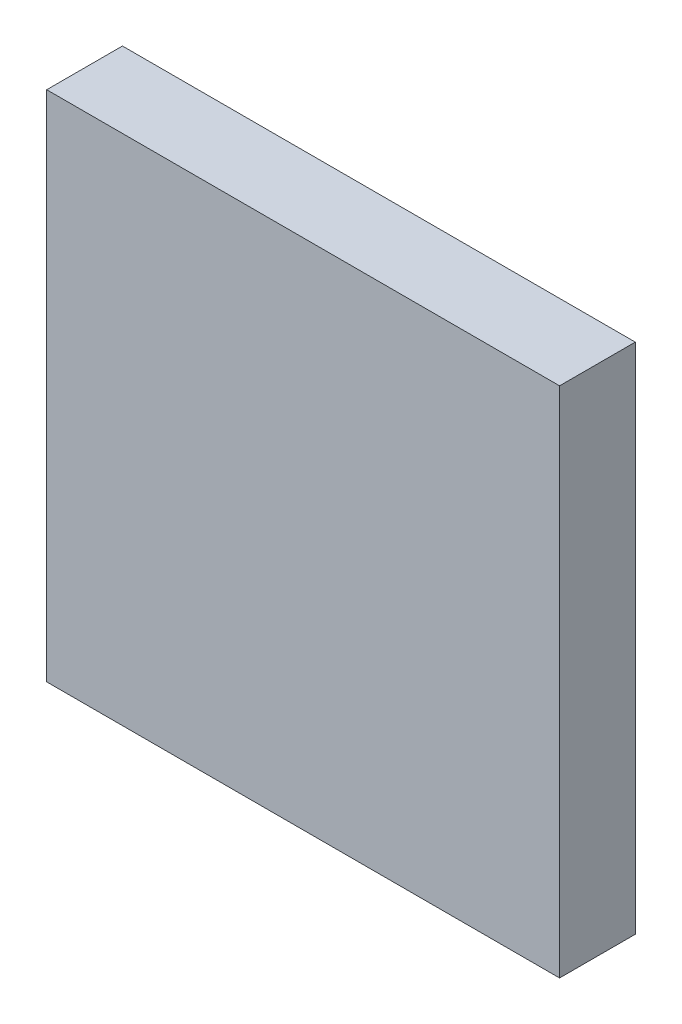
ISO-10303-21;
HEADER;
FILE_DESCRIPTION(('STEP AP214'),'2;1');
FILE_NAME('part.step','',(''),(''),'','','');
FILE_SCHEMA(('AUTOMOTIVE_DESIGN { 1 0 10303 214 1 1 1 1 }'));
ENDSEC;
DATA;
#1=APPLICATION_CONTEXT('core data for automotive mechanical design processes');
#2=APPLICATION_PROTOCOL_DEFINITION('international standard','automotive_design',2000,#1);
#3=PRODUCT_CONTEXT('',#1,'mechanical');
#4=PRODUCT('Part','Part','',(#3));
#5=PRODUCT_RELATED_PRODUCT_CATEGORY('part','',(#4));
#6=PRODUCT_DEFINITION_FORMATION('','',#4);
#7=PRODUCT_DEFINITION_CONTEXT('part definition',#1,'design');
#8=PRODUCT_DEFINITION('design','',#6,#7);
#9=PRODUCT_DEFINITION_SHAPE('','',#8);
#10=(LENGTH_UNIT() NAMED_UNIT(*) SI_UNIT(.MILLI.,.METRE.));
#11=(NAMED_UNIT(*) PLANE_ANGLE_UNIT() SI_UNIT($,.RADIAN.));
#12=(NAMED_UNIT(*) SI_UNIT($,.STERADIAN.) SOLID_ANGLE_UNIT());
#13=UNCERTAINTY_MEASURE_WITH_UNIT(LENGTH_MEASURE(1.E-05),#10,'distance_accuracy_value','');
#14=(GEOMETRIC_REPRESENTATION_CONTEXT(3) GLOBAL_UNCERTAINTY_ASSIGNED_CONTEXT((#13)) GLOBAL_UNIT_ASSIGNED_CONTEXT((#10,
#11,#12)) REPRESENTATION_CONTEXT('',''));
#15=CARTESIAN_POINT('',(0.,0.,0.));
#16=DIRECTION('',(0.,0.,1.));
#17=DIRECTION('',(1.,0.,0.));
#18=AXIS2_PLACEMENT_3D('',#15,#16,#17);
#19=CARTESIAN_POINT('',(7.62,-8.89,3.));
#20=DIRECTION('',(0.,0.,-1.));
#21=DIRECTION('',(-1.,0.,0.));
#22=AXIS2_PLACEMENT_3D('',#19,#20,#21);
#23=PLANE('',#22);
#24=DIRECTION('',(1.,0.,0.));
#25=VECTOR('',#24,1.);
#26=CARTESIAN_POINT('',(17.78,-19.05,3.));
#27=LINE('',#26,#25);
#28=CARTESIAN_POINT('',(17.78,-19.05,3.));
#29=VERTEX_POINT('',#28);
#30=CARTESIAN_POINT('',(-2.54,-19.05,3.));
#31=VERTEX_POINT('',#30);
#32=EDGE_CURVE('E68',#29,#31,#27,.F.);
#33=ORIENTED_EDGE('',*,*,#32,.F.);
#34=DIRECTION('',(0.,1.,0.));
#35=VECTOR('',#34,1.);
#36=CARTESIAN_POINT('',(17.78,1.27,3.));
#37=LINE('',#36,#35);
#38=CARTESIAN_POINT('',(17.78,1.27,3.));
#39=VERTEX_POINT('',#38);
#40=EDGE_CURVE('E55',#39,#29,#37,.F.);
#41=ORIENTED_EDGE('',*,*,#40,.F.);
#42=DIRECTION('',(1.,0.,0.));
#43=VECTOR('',#42,1.);
#44=CARTESIAN_POINT('',(-2.54,1.27,3.));
#45=LINE('',#44,#43);
#46=CARTESIAN_POINT('',(-2.54,1.27,3.));
#47=VERTEX_POINT('',#46);
#48=EDGE_CURVE('E20',#47,#39,#45,.T.);
#49=ORIENTED_EDGE('',*,*,#48,.F.);
#50=DIRECTION('',(0.,1.,0.));
#51=VECTOR('',#50,1.);
#52=CARTESIAN_POINT('',(-2.54,-19.05,3.));
#53=LINE('',#52,#51);
#54=EDGE_CURVE('E80',#31,#47,#53,.T.);
#55=ORIENTED_EDGE('',*,*,#54,.F.);
#56=EDGE_LOOP('',(#33,#41,#49,#55));
#57=FACE_BOUND('',#56,.T.);
#58=ADVANCED_FACE('F17',(#57),#23,.F.);
#59=CARTESIAN_POINT('',(-2.54,1.27,0.));
#60=DIRECTION('',(0.,1.,0.));
#61=DIRECTION('',(0.,0.,1.));
#62=AXIS2_PLACEMENT_3D('',#59,#60,#61);
#63=PLANE('',#62);
#64=DIRECTION('',(0.,0.,-1.));
#65=VECTOR('',#64,1.);
#66=CARTESIAN_POINT('',(17.78,1.27,0.));
#67=LINE('',#66,#65);
#68=CARTESIAN_POINT('',(17.78,1.27,0.));
#69=VERTEX_POINT('',#68);
#70=EDGE_CURVE('E61',#69,#39,#67,.F.);
#71=ORIENTED_EDGE('',*,*,#70,.F.);
#72=DIRECTION('',(-1.,0.,0.));
#73=VECTOR('',#72,1.);
#74=CARTESIAN_POINT('',(7.62,1.27,0.));
#75=LINE('',#74,#73);
#76=CARTESIAN_POINT('',(-2.54,1.27,0.));
#77=VERTEX_POINT('',#76);
#78=EDGE_CURVE('E83',#77,#69,#75,.F.);
#79=ORIENTED_EDGE('',*,*,#78,.F.);
#80=DIRECTION('',(0.,0.,1.));
#81=VECTOR('',#80,1.);
#82=CARTESIAN_POINT('',(-2.54,1.27,0.));
#83=LINE('',#82,#81);
#84=EDGE_CURVE('E64',#47,#77,#83,.F.);
#85=ORIENTED_EDGE('',*,*,#84,.F.);
#86=ORIENTED_EDGE('',*,*,#48,.T.);
#87=EDGE_LOOP('',(#71,#79,#85,#86));
#88=FACE_BOUND('',#87,.T.);
#89=ADVANCED_FACE('F60',(#88),#63,.T.);
#90=CARTESIAN_POINT('',(17.78,1.27,0.));
#91=DIRECTION('',(1.,0.,0.));
#92=DIRECTION('',(0.,0.,-1.));
#93=AXIS2_PLACEMENT_3D('',#90,#91,#92);
#94=PLANE('',#93);
#95=DIRECTION('',(0.,0.,-1.));
#96=VECTOR('',#95,1.);
#97=CARTESIAN_POINT('',(17.78,-19.05,0.));
#98=LINE('',#97,#96);
#99=CARTESIAN_POINT('',(17.78,-19.05,0.));
#100=VERTEX_POINT('',#99);
#101=EDGE_CURVE('E70',#100,#29,#98,.F.);
#102=ORIENTED_EDGE('',*,*,#101,.F.);
#103=DIRECTION('',(0.,1.,0.));
#104=VECTOR('',#103,1.);
#105=CARTESIAN_POINT('',(17.78,-8.89,0.));
#106=LINE('',#105,#104);
#107=EDGE_CURVE('E74',#69,#100,#106,.F.);
#108=ORIENTED_EDGE('',*,*,#107,.F.);
#109=ORIENTED_EDGE('',*,*,#70,.T.);
#110=ORIENTED_EDGE('',*,*,#40,.T.);
#111=EDGE_LOOP('',(#102,#108,#109,#110));
#112=FACE_BOUND('',#111,.T.);
#113=ADVANCED_FACE('F72',(#112),#94,.T.);
#114=CARTESIAN_POINT('',(17.78,-19.05,0.));
#115=DIRECTION('',(0.,-1.,0.));
#116=DIRECTION('',(0.,0.,-1.));
#117=AXIS2_PLACEMENT_3D('',#114,#115,#116);
#118=PLANE('',#117);
#119=DIRECTION('',(0.,0.,1.));
#120=VECTOR('',#119,1.);
#121=CARTESIAN_POINT('',(-2.54,-19.05,0.));
#122=LINE('',#121,#120);
#123=CARTESIAN_POINT('',(-2.54,-19.05,0.));
#124=VERTEX_POINT('',#123);
#125=EDGE_CURVE('E35',#124,#31,#122,.T.);
#126=ORIENTED_EDGE('',*,*,#125,.F.);
#127=DIRECTION('',(-1.,0.,0.));
#128=VECTOR('',#127,1.);
#129=CARTESIAN_POINT('',(7.62,-19.05,0.));
#130=LINE('',#129,#128);
#131=EDGE_CURVE('E26',#100,#124,#130,.T.);
#132=ORIENTED_EDGE('',*,*,#131,.F.);
#133=ORIENTED_EDGE('',*,*,#101,.T.);
#134=ORIENTED_EDGE('',*,*,#32,.T.);
#135=EDGE_LOOP('',(#126,#132,#133,#134));
#136=FACE_BOUND('',#135,.T.);
#137=ADVANCED_FACE('F89',(#136),#118,.T.);
#138=CARTESIAN_POINT('',(-2.54,-19.05,0.));
#139=DIRECTION('',(-1.,0.,0.));
#140=DIRECTION('',(0.,0.,1.));
#141=AXIS2_PLACEMENT_3D('',#138,#139,#140);
#142=PLANE('',#141);
#143=ORIENTED_EDGE('',*,*,#84,.T.);
#144=DIRECTION('',(0.,1.,0.));
#145=VECTOR('',#144,1.);
#146=CARTESIAN_POINT('',(-2.54,-8.89,0.));
#147=LINE('',#146,#145);
#148=EDGE_CURVE('E11',#124,#77,#147,.T.);
#149=ORIENTED_EDGE('',*,*,#148,.F.);
#150=ORIENTED_EDGE('',*,*,#125,.T.);
#151=ORIENTED_EDGE('',*,*,#54,.T.);
#152=EDGE_LOOP('',(#143,#149,#150,#151));
#153=FACE_BOUND('',#152,.T.);
#154=ADVANCED_FACE('F91',(#153),#142,.T.);
#155=CARTESIAN_POINT('',(7.62,-8.89,0.));
#156=DIRECTION('',(0.,0.,-1.));
#157=DIRECTION('',(-1.,0.,0.));
#158=AXIS2_PLACEMENT_3D('',#155,#156,#157);
#159=PLANE('',#158);
#160=ORIENTED_EDGE('',*,*,#131,.T.);
#161=ORIENTED_EDGE('',*,*,#148,.T.);
#162=ORIENTED_EDGE('',*,*,#78,.T.);
#163=ORIENTED_EDGE('',*,*,#107,.T.);
#164=EDGE_LOOP('',(#160,#161,#162,#163));
#165=FACE_BOUND('',#164,.T.);
#166=ADVANCED_FACE('F88',(#165),#159,.T.);
#167=CLOSED_SHELL('',(#58,#89,#113,#137,#154,#166));
#168=MANIFOLD_SOLID_BREP('B1',#167);
#169=ADVANCED_BREP_SHAPE_REPRESENTATION('',(#18,#168),#14);
#170=SHAPE_DEFINITION_REPRESENTATION(#9,#169);
ENDSEC;
END-ISO-10303-21;
